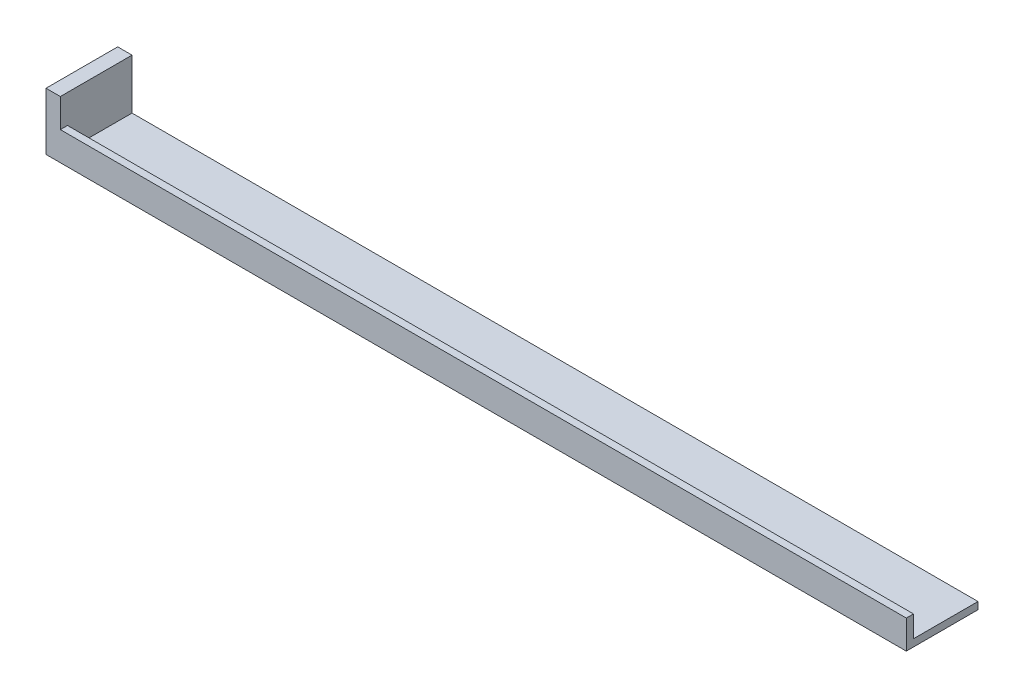
ISO-10303-21;
HEADER;
FILE_DESCRIPTION(('STEP AP214'),'2;1');
FILE_NAME('part.step','',(''),(''),'','','');
FILE_SCHEMA(('AUTOMOTIVE_DESIGN { 1 0 10303 214 1 1 1 1 }'));
ENDSEC;
DATA;
#1=APPLICATION_CONTEXT('core data for automotive mechanical design processes');
#2=APPLICATION_PROTOCOL_DEFINITION('international standard','automotive_design',2000,#1);
#3=PRODUCT_CONTEXT('',#1,'mechanical');
#4=PRODUCT('Part','Part','',(#3));
#5=PRODUCT_RELATED_PRODUCT_CATEGORY('part','',(#4));
#6=PRODUCT_DEFINITION_FORMATION('','',#4);
#7=PRODUCT_DEFINITION_CONTEXT('part definition',#1,'design');
#8=PRODUCT_DEFINITION('design','',#6,#7);
#9=PRODUCT_DEFINITION_SHAPE('','',#8);
#10=(LENGTH_UNIT() NAMED_UNIT(*) SI_UNIT(.MILLI.,.METRE.));
#11=(NAMED_UNIT(*) PLANE_ANGLE_UNIT() SI_UNIT($,.RADIAN.));
#12=(NAMED_UNIT(*) SI_UNIT($,.STERADIAN.) SOLID_ANGLE_UNIT());
#13=UNCERTAINTY_MEASURE_WITH_UNIT(LENGTH_MEASURE(1.E-05),#10,'distance_accuracy_value','');
#14=(GEOMETRIC_REPRESENTATION_CONTEXT(3) GLOBAL_UNCERTAINTY_ASSIGNED_CONTEXT((#13)) GLOBAL_UNIT_ASSIGNED_CONTEXT((#10,
#11,#12)) REPRESENTATION_CONTEXT('',''));
#15=CARTESIAN_POINT('',(0.,0.,0.));
#16=DIRECTION('',(0.,0.,1.));
#17=DIRECTION('',(1.,0.,0.));
#18=AXIS2_PLACEMENT_3D('',#15,#16,#17);
#19=CARTESIAN_POINT('',(2.,-1.,10.));
#20=DIRECTION('',(0.,1.,0.));
#21=DIRECTION('',(0.,0.,1.));
#22=AXIS2_PLACEMENT_3D('',#19,#20,#21);
#23=PLANE('',#22);
#24=DIRECTION('',(1.,0.,0.));
#25=VECTOR('',#24,1.);
#26=CARTESIAN_POINT('',(2.,-1.,10.));
#27=LINE('',#26,#25);
#28=CARTESIAN_POINT('',(0.,-1.,10.));
#29=VERTEX_POINT('',#28);
#30=CARTESIAN_POINT('',(120.,-1.,10.));
#31=VERTEX_POINT('',#30);
#32=EDGE_CURVE('E119',#29,#31,#27,.T.);
#33=ORIENTED_EDGE('',*,*,#32,.F.);
#34=DIRECTION('',(0.,0.,-1.));
#35=VECTOR('',#34,1.);
#36=CARTESIAN_POINT('',(0.,-1.,10.));
#37=LINE('',#36,#35);
#38=CARTESIAN_POINT('',(0.,-1.,0.));
#39=VERTEX_POINT('',#38);
#40=EDGE_CURVE('E167',#29,#39,#37,.T.);
#41=ORIENTED_EDGE('',*,*,#40,.T.);
#42=DIRECTION('',(1.,0.,0.));
#43=VECTOR('',#42,1.);
#44=CARTESIAN_POINT('',(2.,-1.,0.));
#45=LINE('',#44,#43);
#46=CARTESIAN_POINT('',(120.,-1.,0.));
#47=VERTEX_POINT('',#46);
#48=EDGE_CURVE('E106',#39,#47,#45,.T.);
#49=ORIENTED_EDGE('',*,*,#48,.T.);
#50=DIRECTION('',(0.,0.,-1.));
#51=VECTOR('',#50,1.);
#52=CARTESIAN_POINT('',(120.,-1.,10.));
#53=LINE('',#52,#51);
#54=EDGE_CURVE('E142',#31,#47,#53,.T.);
#55=ORIENTED_EDGE('',*,*,#54,.F.);
#56=EDGE_LOOP('',(#33,#41,#49,#55));
#57=FACE_BOUND('',#56,.T.);
#58=ADVANCED_FACE('F32',(#57),#23,.F.);
#59=CARTESIAN_POINT('',(2.,3.,10.));
#60=DIRECTION('',(-1.,0.,0.));
#61=DIRECTION('',(0.,0.,1.));
#62=AXIS2_PLACEMENT_3D('',#59,#60,#61);
#63=PLANE('',#62);
#64=DIRECTION('',(0.,0.,1.));
#65=VECTOR('',#64,1.);
#66=CARTESIAN_POINT('',(2.,3.,10.));
#67=LINE('',#66,#65);
#68=CARTESIAN_POINT('',(2.,3.,9.));
#69=VERTEX_POINT('',#68);
#70=CARTESIAN_POINT('',(2.,3.,10.));
#71=VERTEX_POINT('',#70);
#72=EDGE_CURVE('E53',#69,#71,#67,.T.);
#73=ORIENTED_EDGE('',*,*,#72,.F.);
#74=DIRECTION('',(0.,-1.,0.));
#75=VECTOR('',#74,1.);
#76=CARTESIAN_POINT('',(2.,3.,9.));
#77=LINE('',#76,#75);
#78=CARTESIAN_POINT('',(2.,0.,9.));
#79=VERTEX_POINT('',#78);
#80=EDGE_CURVE('E156',#69,#79,#77,.T.);
#81=ORIENTED_EDGE('',*,*,#80,.T.);
#82=DIRECTION('',(0.,0.,-1.));
#83=VECTOR('',#82,1.);
#84=CARTESIAN_POINT('',(2.,0.,10.));
#85=LINE('',#84,#83);
#86=CARTESIAN_POINT('',(2.,0.,0.));
#87=VERTEX_POINT('',#86);
#88=EDGE_CURVE('E124',#79,#87,#85,.T.);
#89=ORIENTED_EDGE('',*,*,#88,.T.);
#90=DIRECTION('',(0.,1.,0.));
#91=VECTOR('',#90,1.);
#92=CARTESIAN_POINT('',(2.,3.,0.));
#93=LINE('',#92,#91);
#94=CARTESIAN_POINT('',(2.,7.,0.));
#95=VERTEX_POINT('',#94);
#96=EDGE_CURVE('E113',#87,#95,#93,.T.);
#97=ORIENTED_EDGE('',*,*,#96,.T.);
#98=DIRECTION('',(0.,0.,-1.));
#99=VECTOR('',#98,1.);
#100=CARTESIAN_POINT('',(2.,7.,0.));
#101=LINE('',#100,#99);
#102=CARTESIAN_POINT('',(2.,7.,10.));
#103=VERTEX_POINT('',#102);
#104=EDGE_CURVE('E111',#103,#95,#101,.T.);
#105=ORIENTED_EDGE('',*,*,#104,.F.);
#106=DIRECTION('',(0.,1.,0.));
#107=VECTOR('',#106,1.);
#108=CARTESIAN_POINT('',(2.,3.,10.));
#109=LINE('',#108,#107);
#110=EDGE_CURVE('E39',#71,#103,#109,.T.);
#111=ORIENTED_EDGE('',*,*,#110,.F.);
#112=EDGE_LOOP('',(#73,#81,#89,#97,#105,#111));
#113=FACE_BOUND('',#112,.T.);
#114=ADVANCED_FACE('F122',(#113),#63,.F.);
#115=CARTESIAN_POINT('',(0.,0.,10.));
#116=DIRECTION('',(0.,0.,-1.));
#117=DIRECTION('',(-1.,0.,0.));
#118=AXIS2_PLACEMENT_3D('',#115,#116,#117);
#119=PLANE('',#118);
#120=DIRECTION('',(1.,0.,0.));
#121=VECTOR('',#120,1.);
#122=CARTESIAN_POINT('',(0.,7.,10.));
#123=LINE('',#122,#121);
#124=CARTESIAN_POINT('',(0.,7.,10.));
#125=VERTEX_POINT('',#124);
#126=EDGE_CURVE('E115',#125,#103,#123,.T.);
#127=ORIENTED_EDGE('',*,*,#126,.F.);
#128=DIRECTION('',(0.,-1.,0.));
#129=VECTOR('',#128,1.);
#130=CARTESIAN_POINT('',(0.,0.,10.));
#131=LINE('',#130,#129);
#132=EDGE_CURVE('E45',#125,#29,#131,.T.);
#133=ORIENTED_EDGE('',*,*,#132,.T.);
#134=ORIENTED_EDGE('',*,*,#32,.T.);
#135=DIRECTION('',(0.,-1.,0.));
#136=VECTOR('',#135,1.);
#137=CARTESIAN_POINT('',(120.,0.,10.));
#138=LINE('',#137,#136);
#139=CARTESIAN_POINT('',(120.,3.,10.));
#140=VERTEX_POINT('',#139);
#141=EDGE_CURVE('E134',#140,#31,#138,.T.);
#142=ORIENTED_EDGE('',*,*,#141,.F.);
#143=DIRECTION('',(1.,0.,0.));
#144=VECTOR('',#143,1.);
#145=CARTESIAN_POINT('',(120.,3.,10.));
#146=LINE('',#145,#144);
#147=EDGE_CURVE('E149',#71,#140,#146,.T.);
#148=ORIENTED_EDGE('',*,*,#147,.F.);
#149=ORIENTED_EDGE('',*,*,#110,.T.);
#150=EDGE_LOOP('',(#127,#133,#134,#142,#148,#149));
#151=FACE_BOUND('',#150,.T.);
#152=ADVANCED_FACE('F147',(#151),#119,.F.);
#153=CARTESIAN_POINT('',(0.,0.,0.));
#154=DIRECTION('',(0.,0.,-1.));
#155=DIRECTION('',(-1.,0.,0.));
#156=AXIS2_PLACEMENT_3D('',#153,#154,#155);
#157=PLANE('',#156);
#158=DIRECTION('',(0.,-1.,0.));
#159=VECTOR('',#158,1.);
#160=CARTESIAN_POINT('',(0.,7.,0.));
#161=LINE('',#160,#159);
#162=CARTESIAN_POINT('',(0.,7.,0.));
#163=VERTEX_POINT('',#162);
#164=EDGE_CURVE('E94',#163,#39,#161,.T.);
#165=ORIENTED_EDGE('',*,*,#164,.F.);
#166=DIRECTION('',(-1.,0.,0.));
#167=VECTOR('',#166,1.);
#168=CARTESIAN_POINT('',(0.,7.,0.));
#169=LINE('',#168,#167);
#170=EDGE_CURVE('E104',#95,#163,#169,.T.);
#171=ORIENTED_EDGE('',*,*,#170,.F.);
#172=ORIENTED_EDGE('',*,*,#96,.F.);
#173=DIRECTION('',(1.,0.,0.));
#174=VECTOR('',#173,1.);
#175=CARTESIAN_POINT('',(0.,0.,0.));
#176=LINE('',#175,#174);
#177=CARTESIAN_POINT('',(120.,0.,0.));
#178=VERTEX_POINT('',#177);
#179=EDGE_CURVE('E127',#87,#178,#176,.T.);
#180=ORIENTED_EDGE('',*,*,#179,.T.);
#181=DIRECTION('',(0.,-1.,0.));
#182=VECTOR('',#181,1.);
#183=CARTESIAN_POINT('',(120.,0.,0.));
#184=LINE('',#183,#182);
#185=EDGE_CURVE('E135',#178,#47,#184,.T.);
#186=ORIENTED_EDGE('',*,*,#185,.T.);
#187=ORIENTED_EDGE('',*,*,#48,.F.);
#188=EDGE_LOOP('',(#165,#171,#172,#180,#186,#187));
#189=FACE_BOUND('',#188,.T.);
#190=ADVANCED_FACE('F102',(#189),#157,.T.);
#191=CARTESIAN_POINT('',(0.,7.,0.));
#192=DIRECTION('',(0.,1.,0.));
#193=DIRECTION('',(0.,0.,1.));
#194=AXIS2_PLACEMENT_3D('',#191,#192,#193);
#195=PLANE('',#194);
#196=DIRECTION('',(0.,0.,-1.));
#197=VECTOR('',#196,1.);
#198=CARTESIAN_POINT('',(0.,7.,0.));
#199=LINE('',#198,#197);
#200=EDGE_CURVE('E11',#125,#163,#199,.T.);
#201=ORIENTED_EDGE('',*,*,#200,.F.);
#202=ORIENTED_EDGE('',*,*,#126,.T.);
#203=ORIENTED_EDGE('',*,*,#104,.T.);
#204=ORIENTED_EDGE('',*,*,#170,.T.);
#205=EDGE_LOOP('',(#201,#202,#203,#204));
#206=FACE_BOUND('',#205,.T.);
#207=ADVANCED_FACE('F109',(#206),#195,.T.);
#208=CARTESIAN_POINT('',(0.,0.,10.));
#209=DIRECTION('',(0.,1.,0.));
#210=DIRECTION('',(0.,0.,1.));
#211=AXIS2_PLACEMENT_3D('',#208,#209,#210);
#212=PLANE('',#211);
#213=DIRECTION('',(1.,0.,0.));
#214=VECTOR('',#213,1.);
#215=CARTESIAN_POINT('',(120.,0.,9.));
#216=LINE('',#215,#214);
#217=CARTESIAN_POINT('',(120.,0.,9.));
#218=VERTEX_POINT('',#217);
#219=EDGE_CURVE('E165',#79,#218,#216,.T.);
#220=ORIENTED_EDGE('',*,*,#219,.T.);
#221=DIRECTION('',(0.,0.,-1.));
#222=VECTOR('',#221,1.);
#223=CARTESIAN_POINT('',(120.,0.,10.));
#224=LINE('',#223,#222);
#225=EDGE_CURVE('E133',#218,#178,#224,.T.);
#226=ORIENTED_EDGE('',*,*,#225,.T.);
#227=ORIENTED_EDGE('',*,*,#179,.F.);
#228=ORIENTED_EDGE('',*,*,#88,.F.);
#229=EDGE_LOOP('',(#220,#226,#227,#228));
#230=FACE_BOUND('',#229,.T.);
#231=ADVANCED_FACE('F131',(#230),#212,.T.);
#232=CARTESIAN_POINT('',(120.,0.,10.));
#233=DIRECTION('',(1.,0.,0.));
#234=DIRECTION('',(0.,0.,-1.));
#235=AXIS2_PLACEMENT_3D('',#232,#233,#234);
#236=PLANE('',#235);
#237=ORIENTED_EDGE('',*,*,#185,.F.);
#238=ORIENTED_EDGE('',*,*,#225,.F.);
#239=DIRECTION('',(0.,-1.,0.));
#240=VECTOR('',#239,1.);
#241=CARTESIAN_POINT('',(120.,123.004166594331,9.));
#242=LINE('',#241,#240);
#243=CARTESIAN_POINT('',(120.,3.,9.));
#244=VERTEX_POINT('',#243);
#245=EDGE_CURVE('E162',#244,#218,#242,.T.);
#246=ORIENTED_EDGE('',*,*,#245,.F.);
#247=DIRECTION('',(0.,0.,-1.));
#248=VECTOR('',#247,1.);
#249=CARTESIAN_POINT('',(120.,3.,10.));
#250=LINE('',#249,#248);
#251=EDGE_CURVE('E161',#140,#244,#250,.T.);
#252=ORIENTED_EDGE('',*,*,#251,.F.);
#253=ORIENTED_EDGE('',*,*,#141,.T.);
#254=ORIENTED_EDGE('',*,*,#54,.T.);
#255=EDGE_LOOP('',(#237,#238,#246,#252,#253,#254));
#256=FACE_BOUND('',#255,.T.);
#257=ADVANCED_FACE('F175',(#256),#236,.T.);
#258=CARTESIAN_POINT('',(0.,3.,10.));
#259=DIRECTION('',(0.,-1.,0.));
#260=DIRECTION('',(0.,0.,-1.));
#261=AXIS2_PLACEMENT_3D('',#258,#259,#260);
#262=PLANE('',#261);
#263=DIRECTION('',(-1.,0.,0.));
#264=VECTOR('',#263,1.);
#265=CARTESIAN_POINT('',(120.,3.,9.));
#266=LINE('',#265,#264);
#267=EDGE_CURVE('E155',#244,#69,#266,.T.);
#268=ORIENTED_EDGE('',*,*,#267,.T.);
#269=ORIENTED_EDGE('',*,*,#72,.T.);
#270=ORIENTED_EDGE('',*,*,#147,.T.);
#271=ORIENTED_EDGE('',*,*,#251,.T.);
#272=EDGE_LOOP('',(#268,#269,#270,#271));
#273=FACE_BOUND('',#272,.T.);
#274=ADVANCED_FACE('F152',(#273),#262,.F.);
#275=CARTESIAN_POINT('',(120.,123.004166594331,9.));
#276=DIRECTION('',(0.,0.,-1.));
#277=DIRECTION('',(-1.,0.,0.));
#278=AXIS2_PLACEMENT_3D('',#275,#276,#277);
#279=PLANE('',#278);
#280=ORIENTED_EDGE('',*,*,#80,.F.);
#281=ORIENTED_EDGE('',*,*,#267,.F.);
#282=ORIENTED_EDGE('',*,*,#245,.T.);
#283=ORIENTED_EDGE('',*,*,#219,.F.);
#284=EDGE_LOOP('',(#280,#281,#282,#283));
#285=FACE_BOUND('',#284,.T.);
#286=ADVANCED_FACE('F178',(#285),#279,.T.);
#287=CARTESIAN_POINT('',(0.,7.,33.));
#288=DIRECTION('',(1.,0.,0.));
#289=DIRECTION('',(0.,0.,-1.));
#290=AXIS2_PLACEMENT_3D('',#287,#288,#289);
#291=PLANE('',#290);
#292=ORIENTED_EDGE('',*,*,#132,.F.);
#293=ORIENTED_EDGE('',*,*,#200,.T.);
#294=ORIENTED_EDGE('',*,*,#164,.T.);
#295=ORIENTED_EDGE('',*,*,#40,.F.);
#296=EDGE_LOOP('',(#292,#293,#294,#295));
#297=FACE_BOUND('',#296,.T.);
#298=ADVANCED_FACE('F93',(#297),#291,.F.);
#299=CLOSED_SHELL('',(#58,#114,#152,#190,#207,#231,#257,#274,#286,#298));
#300=MANIFOLD_SOLID_BREP('B2',#299);
#301=ADVANCED_BREP_SHAPE_REPRESENTATION('',(#18,#300),#14);
#302=SHAPE_DEFINITION_REPRESENTATION(#9,#301);
ENDSEC;
END-ISO-10303-21;
